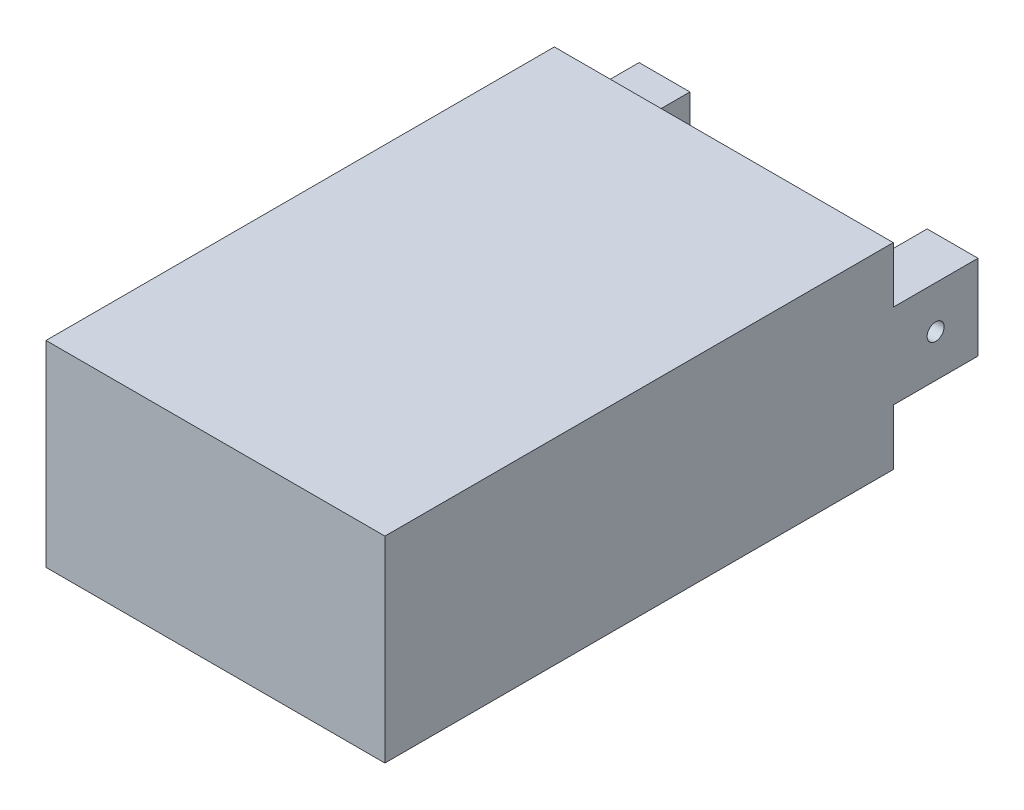
ISO-10303-21;
HEADER;
FILE_DESCRIPTION(('STEP AP214'),'2;1');
FILE_NAME('part.step','',(''),(''),'','','');
FILE_SCHEMA(('AUTOMOTIVE_DESIGN { 1 0 10303 214 1 1 1 1 }'));
ENDSEC;
DATA;
#1=APPLICATION_CONTEXT('core data for automotive mechanical design processes');
#2=APPLICATION_PROTOCOL_DEFINITION('international standard','automotive_design',2000,#1);
#3=PRODUCT_CONTEXT('',#1,'mechanical');
#4=PRODUCT('Part','Part','',(#3));
#5=PRODUCT_RELATED_PRODUCT_CATEGORY('part','',(#4));
#6=PRODUCT_DEFINITION_FORMATION('','',#4);
#7=PRODUCT_DEFINITION_CONTEXT('part definition',#1,'design');
#8=PRODUCT_DEFINITION('design','',#6,#7);
#9=PRODUCT_DEFINITION_SHAPE('','',#8);
#10=(LENGTH_UNIT() NAMED_UNIT(*) SI_UNIT(.MILLI.,.METRE.));
#11=(NAMED_UNIT(*) PLANE_ANGLE_UNIT() SI_UNIT($,.RADIAN.));
#12=(NAMED_UNIT(*) SI_UNIT($,.STERADIAN.) SOLID_ANGLE_UNIT());
#13=UNCERTAINTY_MEASURE_WITH_UNIT(LENGTH_MEASURE(1.E-05),#10,'distance_accuracy_value','');
#14=(GEOMETRIC_REPRESENTATION_CONTEXT(3) GLOBAL_UNCERTAINTY_ASSIGNED_CONTEXT((#13)) GLOBAL_UNIT_ASSIGNED_CONTEXT((#10,
#11,#12)) REPRESENTATION_CONTEXT('',''));
#15=CARTESIAN_POINT('',(0.,0.,0.));
#16=DIRECTION('',(0.,0.,1.));
#17=DIRECTION('',(1.,0.,0.));
#18=AXIS2_PLACEMENT_3D('',#15,#16,#17);
#19=CARTESIAN_POINT('',(0.,0.,0.));
#20=DIRECTION('',(0.,0.,1.));
#21=DIRECTION('',(1.,0.,0.));
#22=AXIS2_PLACEMENT_3D('',#19,#20,#21);
#23=PLANE('',#22);
#24=DIRECTION('',(-1.,0.,0.));
#25=VECTOR('',#24,1.);
#26=CARTESIAN_POINT('',(50.,-12.5,0.));
#27=LINE('',#26,#25);
#28=CARTESIAN_POINT('',(50.,-12.5,0.));
#29=VERTEX_POINT('',#28);
#30=CARTESIAN_POINT('',(35.,-12.5,0.));
#31=VERTEX_POINT('',#30);
#32=EDGE_CURVE('E235',#29,#31,#27,.T.);
#33=ORIENTED_EDGE('',*,*,#32,.F.);
#34=DIRECTION('',(0.,1.,0.));
#35=VECTOR('',#34,1.);
#36=CARTESIAN_POINT('',(50.,-29.,0.));
#37=LINE('',#36,#35);
#38=CARTESIAN_POINT('',(50.,-29.,0.));
#39=VERTEX_POINT('',#38);
#40=EDGE_CURVE('E159',#39,#29,#37,.T.);
#41=ORIENTED_EDGE('',*,*,#40,.F.);
#42=DIRECTION('',(1.,0.,0.));
#43=VECTOR('',#42,1.);
#44=CARTESIAN_POINT('',(50.,-29.,0.));
#45=LINE('',#44,#43);
#46=CARTESIAN_POINT('',(-50.,-29.,0.));
#47=VERTEX_POINT('',#46);
#48=EDGE_CURVE('E209',#47,#39,#45,.T.);
#49=ORIENTED_EDGE('',*,*,#48,.F.);
#50=DIRECTION('',(0.,-1.,0.));
#51=VECTOR('',#50,1.);
#52=CARTESIAN_POINT('',(-50.,-29.,0.));
#53=LINE('',#52,#51);
#54=CARTESIAN_POINT('',(-50.,-12.5,0.));
#55=VERTEX_POINT('',#54);
#56=EDGE_CURVE('E192',#55,#47,#53,.T.);
#57=ORIENTED_EDGE('',*,*,#56,.F.);
#58=DIRECTION('',(-1.,0.,0.));
#59=VECTOR('',#58,1.);
#60=CARTESIAN_POINT('',(-50.,-12.5,0.));
#61=LINE('',#60,#59);
#62=CARTESIAN_POINT('',(-35.,-12.5,0.));
#63=VERTEX_POINT('',#62);
#64=EDGE_CURVE('E70',#63,#55,#61,.T.);
#65=ORIENTED_EDGE('',*,*,#64,.F.);
#66=DIRECTION('',(0.,-1.,0.));
#67=VECTOR('',#66,1.);
#68=CARTESIAN_POINT('',(-35.,-12.5,0.));
#69=LINE('',#68,#67);
#70=CARTESIAN_POINT('',(-35.,12.5,0.));
#71=VERTEX_POINT('',#70);
#72=EDGE_CURVE('E163',#71,#63,#69,.T.);
#73=ORIENTED_EDGE('',*,*,#72,.F.);
#74=DIRECTION('',(1.,0.,0.));
#75=VECTOR('',#74,1.);
#76=CARTESIAN_POINT('',(-35.,12.5,0.));
#77=LINE('',#76,#75);
#78=CARTESIAN_POINT('',(-50.,12.5,0.));
#79=VERTEX_POINT('',#78);
#80=EDGE_CURVE('E160',#79,#71,#77,.T.);
#81=ORIENTED_EDGE('',*,*,#80,.F.);
#82=CARTESIAN_POINT('',(-50.,29.,0.));
#83=VERTEX_POINT('',#82);
#84=EDGE_CURVE('E204',#83,#79,#53,.T.);
#85=ORIENTED_EDGE('',*,*,#84,.F.);
#86=DIRECTION('',(-1.,0.,0.));
#87=VECTOR('',#86,1.);
#88=CARTESIAN_POINT('',(50.,29.,0.));
#89=LINE('',#88,#87);
#90=CARTESIAN_POINT('',(50.,29.,0.));
#91=VERTEX_POINT('',#90);
#92=EDGE_CURVE('E197',#91,#83,#89,.T.);
#93=ORIENTED_EDGE('',*,*,#92,.F.);
#94=CARTESIAN_POINT('',(50.,12.5,0.));
#95=VERTEX_POINT('',#94);
#96=EDGE_CURVE('E236',#95,#91,#37,.T.);
#97=ORIENTED_EDGE('',*,*,#96,.F.);
#98=DIRECTION('',(1.,0.,0.));
#99=VECTOR('',#98,1.);
#100=CARTESIAN_POINT('',(35.,12.5,0.));
#101=LINE('',#100,#99);
#102=CARTESIAN_POINT('',(35.,12.5,0.));
#103=VERTEX_POINT('',#102);
#104=EDGE_CURVE('E153',#103,#95,#101,.T.);
#105=ORIENTED_EDGE('',*,*,#104,.F.);
#106=DIRECTION('',(0.,1.,0.));
#107=VECTOR('',#106,1.);
#108=CARTESIAN_POINT('',(35.,-12.5,0.));
#109=LINE('',#108,#107);
#110=EDGE_CURVE('E410',#31,#103,#109,.T.);
#111=ORIENTED_EDGE('',*,*,#110,.F.);
#112=EDGE_LOOP('',(#33,#41,#49,#57,#65,#73,#81,#85,#93,#97,#105,#111));
#113=FACE_BOUND('',#112,.T.);
#114=ADVANCED_FACE('F46',(#113),#23,.F.);
#115=CARTESIAN_POINT('',(-50.,-29.,150.));
#116=DIRECTION('',(1.,0.,0.));
#117=DIRECTION('',(0.,0.,-1.));
#118=AXIS2_PLACEMENT_3D('',#115,#116,#117);
#119=PLANE('',#118);
#120=CARTESIAN_POINT('',(-50.,0.,-12.5));
#121=DIRECTION('',(-1.,0.,0.));
#122=DIRECTION('',(0.,0.,1.));
#123=AXIS2_PLACEMENT_3D('',#120,#121,#122);
#124=CIRCLE('',#123,2.5);
#125=CARTESIAN_POINT('',(-50.,0.,-10.));
#126=VERTEX_POINT('',#125);
#127=EDGE_CURVE('E425',#126,#126,#124,.T.);
#128=ORIENTED_EDGE('',*,*,#127,.F.);
#129=EDGE_LOOP('',(#128));
#130=FACE_BOUND('',#129,.T.);
#131=ORIENTED_EDGE('',*,*,#84,.T.);
#132=DIRECTION('',(0.,0.,1.));
#133=VECTOR('',#132,1.);
#134=CARTESIAN_POINT('',(-50.,12.5,-25.));
#135=LINE('',#134,#133);
#136=CARTESIAN_POINT('',(-50.,12.5,-25.));
#137=VERTEX_POINT('',#136);
#138=EDGE_CURVE('E189',#137,#79,#135,.T.);
#139=ORIENTED_EDGE('',*,*,#138,.F.);
#140=DIRECTION('',(0.,1.,0.));
#141=VECTOR('',#140,1.);
#142=CARTESIAN_POINT('',(-50.,12.5,-25.));
#143=LINE('',#142,#141);
#144=CARTESIAN_POINT('',(-50.,-12.5,-25.));
#145=VERTEX_POINT('',#144);
#146=EDGE_CURVE('E169',#145,#137,#143,.T.);
#147=ORIENTED_EDGE('',*,*,#146,.F.);
#148=DIRECTION('',(0.,0.,1.));
#149=VECTOR('',#148,1.);
#150=CARTESIAN_POINT('',(-50.,-12.5,-25.));
#151=LINE('',#150,#149);
#152=EDGE_CURVE('E177',#145,#55,#151,.T.);
#153=ORIENTED_EDGE('',*,*,#152,.T.);
#154=ORIENTED_EDGE('',*,*,#56,.T.);
#155=DIRECTION('',(0.,0.,-1.));
#156=VECTOR('',#155,1.);
#157=CARTESIAN_POINT('',(-50.,-29.,150.));
#158=LINE('',#157,#156);
#159=CARTESIAN_POINT('',(-50.,-29.,150.));
#160=VERTEX_POINT('',#159);
#161=EDGE_CURVE('E12',#160,#47,#158,.T.);
#162=ORIENTED_EDGE('',*,*,#161,.F.);
#163=DIRECTION('',(0.,-1.,0.));
#164=VECTOR('',#163,1.);
#165=CARTESIAN_POINT('',(-50.,-29.,150.));
#166=LINE('',#165,#164);
#167=CARTESIAN_POINT('',(-50.,29.,150.));
#168=VERTEX_POINT('',#167);
#169=EDGE_CURVE('E193',#168,#160,#166,.T.);
#170=ORIENTED_EDGE('',*,*,#169,.F.);
#171=DIRECTION('',(0.,0.,-1.));
#172=VECTOR('',#171,1.);
#173=CARTESIAN_POINT('',(-50.,29.,150.));
#174=LINE('',#173,#172);
#175=EDGE_CURVE('E203',#168,#83,#174,.T.);
#176=ORIENTED_EDGE('',*,*,#175,.T.);
#177=EDGE_LOOP('',(#131,#139,#147,#153,#154,#162,#170,#176));
#178=FACE_BOUND('',#177,.T.);
#179=ADVANCED_FACE('F48',(#130,#178),#119,.F.);
#180=CARTESIAN_POINT('',(50.,-29.,150.));
#181=DIRECTION('',(0.,1.,0.));
#182=DIRECTION('',(-1.,0.,0.));
#183=AXIS2_PLACEMENT_3D('',#180,#181,#182);
#184=PLANE('',#183);
#185=ORIENTED_EDGE('',*,*,#48,.T.);
#186=DIRECTION('',(0.,0.,-1.));
#187=VECTOR('',#186,1.);
#188=CARTESIAN_POINT('',(50.,-29.,150.));
#189=LINE('',#188,#187);
#190=CARTESIAN_POINT('',(50.,-29.,150.));
#191=VERTEX_POINT('',#190);
#192=EDGE_CURVE('E55',#191,#39,#189,.T.);
#193=ORIENTED_EDGE('',*,*,#192,.F.);
#194=DIRECTION('',(1.,0.,0.));
#195=VECTOR('',#194,1.);
#196=CARTESIAN_POINT('',(50.,-29.,150.));
#197=LINE('',#196,#195);
#198=EDGE_CURVE('E196',#160,#191,#197,.T.);
#199=ORIENTED_EDGE('',*,*,#198,.F.);
#200=ORIENTED_EDGE('',*,*,#161,.T.);
#201=EDGE_LOOP('',(#185,#193,#199,#200));
#202=FACE_BOUND('',#201,.T.);
#203=ADVANCED_FACE('F240',(#202),#184,.F.);
#204=CARTESIAN_POINT('',(50.,-29.,150.));
#205=DIRECTION('',(-1.,0.,0.));
#206=DIRECTION('',(0.,0.,1.));
#207=AXIS2_PLACEMENT_3D('',#204,#205,#206);
#208=PLANE('',#207);
#209=CARTESIAN_POINT('',(50.,0.,-12.5));
#210=DIRECTION('',(-1.,0.,0.));
#211=DIRECTION('',(0.,0.,1.));
#212=AXIS2_PLACEMENT_3D('',#209,#210,#211);
#213=CIRCLE('',#212,2.5);
#214=CARTESIAN_POINT('',(50.,0.,-10.));
#215=VERTEX_POINT('',#214);
#216=EDGE_CURVE('E413',#215,#215,#213,.F.);
#217=ORIENTED_EDGE('',*,*,#216,.F.);
#218=EDGE_LOOP('',(#217));
#219=FACE_BOUND('',#218,.T.);
#220=ORIENTED_EDGE('',*,*,#40,.T.);
#221=DIRECTION('',(0.,0.,1.));
#222=VECTOR('',#221,1.);
#223=CARTESIAN_POINT('',(50.,-12.5,-25.));
#224=LINE('',#223,#222);
#225=CARTESIAN_POINT('',(50.,-12.5,-25.));
#226=VERTEX_POINT('',#225);
#227=EDGE_CURVE('E141',#226,#29,#224,.T.);
#228=ORIENTED_EDGE('',*,*,#227,.F.);
#229=DIRECTION('',(0.,-1.,0.));
#230=VECTOR('',#229,1.);
#231=CARTESIAN_POINT('',(50.,12.5,-25.));
#232=LINE('',#231,#230);
#233=CARTESIAN_POINT('',(50.,12.5,-25.));
#234=VERTEX_POINT('',#233);
#235=EDGE_CURVE('E148',#234,#226,#232,.T.);
#236=ORIENTED_EDGE('',*,*,#235,.F.);
#237=DIRECTION('',(0.,0.,1.));
#238=VECTOR('',#237,1.);
#239=CARTESIAN_POINT('',(50.,12.5,-25.));
#240=LINE('',#239,#238);
#241=EDGE_CURVE('E62',#234,#95,#240,.T.);
#242=ORIENTED_EDGE('',*,*,#241,.T.);
#243=ORIENTED_EDGE('',*,*,#96,.T.);
#244=DIRECTION('',(0.,0.,-1.));
#245=VECTOR('',#244,1.);
#246=CARTESIAN_POINT('',(50.,29.,150.));
#247=LINE('',#246,#245);
#248=CARTESIAN_POINT('',(50.,29.,150.));
#249=VERTEX_POINT('',#248);
#250=EDGE_CURVE('E223',#249,#91,#247,.T.);
#251=ORIENTED_EDGE('',*,*,#250,.F.);
#252=DIRECTION('',(0.,1.,0.));
#253=VECTOR('',#252,1.);
#254=CARTESIAN_POINT('',(50.,-29.,150.));
#255=LINE('',#254,#253);
#256=EDGE_CURVE('E199',#191,#249,#255,.T.);
#257=ORIENTED_EDGE('',*,*,#256,.F.);
#258=ORIENTED_EDGE('',*,*,#192,.T.);
#259=EDGE_LOOP('',(#220,#228,#236,#242,#243,#251,#257,#258));
#260=FACE_BOUND('',#259,.T.);
#261=ADVANCED_FACE('F156',(#219,#260),#208,.F.);
#262=CARTESIAN_POINT('',(50.,29.,150.));
#263=DIRECTION('',(0.,-1.,0.));
#264=DIRECTION('',(1.,0.,0.));
#265=AXIS2_PLACEMENT_3D('',#262,#263,#264);
#266=PLANE('',#265);
#267=ORIENTED_EDGE('',*,*,#92,.T.);
#268=ORIENTED_EDGE('',*,*,#175,.F.);
#269=DIRECTION('',(-1.,0.,0.));
#270=VECTOR('',#269,1.);
#271=CARTESIAN_POINT('',(50.,29.,150.));
#272=LINE('',#271,#270);
#273=EDGE_CURVE('E201',#249,#168,#272,.T.);
#274=ORIENTED_EDGE('',*,*,#273,.F.);
#275=ORIENTED_EDGE('',*,*,#250,.T.);
#276=EDGE_LOOP('',(#267,#268,#274,#275));
#277=FACE_BOUND('',#276,.T.);
#278=ADVANCED_FACE('F262',(#277),#266,.F.);
#279=CARTESIAN_POINT('',(0.,0.,150.));
#280=DIRECTION('',(0.,0.,1.));
#281=DIRECTION('',(1.,0.,0.));
#282=AXIS2_PLACEMENT_3D('',#279,#280,#281);
#283=PLANE('',#282);
#284=ORIENTED_EDGE('',*,*,#169,.T.);
#285=ORIENTED_EDGE('',*,*,#198,.T.);
#286=ORIENTED_EDGE('',*,*,#256,.T.);
#287=ORIENTED_EDGE('',*,*,#273,.T.);
#288=EDGE_LOOP('',(#284,#285,#286,#287));
#289=FACE_BOUND('',#288,.T.);
#290=ADVANCED_FACE('F265',(#289),#283,.T.);
#291=CARTESIAN_POINT('',(-35.,12.5,-25.));
#292=DIRECTION('',(0.,-1.,0.));
#293=DIRECTION('',(1.,0.,0.));
#294=AXIS2_PLACEMENT_3D('',#291,#292,#293);
#295=PLANE('',#294);
#296=ORIENTED_EDGE('',*,*,#80,.T.);
#297=DIRECTION('',(0.,0.,1.));
#298=VECTOR('',#297,1.);
#299=CARTESIAN_POINT('',(-35.,12.5,-25.));
#300=LINE('',#299,#298);
#301=CARTESIAN_POINT('',(-35.,12.5,-25.));
#302=VERTEX_POINT('',#301);
#303=EDGE_CURVE('E186',#302,#71,#300,.T.);
#304=ORIENTED_EDGE('',*,*,#303,.F.);
#305=DIRECTION('',(1.,0.,0.));
#306=VECTOR('',#305,1.);
#307=CARTESIAN_POINT('',(-35.,12.5,-25.));
#308=LINE('',#307,#306);
#309=EDGE_CURVE('E172',#137,#302,#308,.T.);
#310=ORIENTED_EDGE('',*,*,#309,.F.);
#311=ORIENTED_EDGE('',*,*,#138,.T.);
#312=EDGE_LOOP('',(#296,#304,#310,#311));
#313=FACE_BOUND('',#312,.T.);
#314=ADVANCED_FACE('F256',(#313),#295,.F.);
#315=CARTESIAN_POINT('',(-35.,-12.5,-25.));
#316=DIRECTION('',(-1.,0.,0.));
#317=DIRECTION('',(0.,0.,1.));
#318=AXIS2_PLACEMENT_3D('',#315,#316,#317);
#319=PLANE('',#318);
#320=CARTESIAN_POINT('',(-35.,0.,-12.5));
#321=DIRECTION('',(-1.,0.,0.));
#322=DIRECTION('',(0.,0.,1.));
#323=AXIS2_PLACEMENT_3D('',#320,#321,#322);
#324=CIRCLE('',#323,2.5);
#325=CARTESIAN_POINT('',(-35.,0.,-10.));
#326=VERTEX_POINT('',#325);
#327=EDGE_CURVE('E408',#326,#326,#324,.T.);
#328=ORIENTED_EDGE('',*,*,#327,.T.);
#329=EDGE_LOOP('',(#328));
#330=FACE_BOUND('',#329,.T.);
#331=ORIENTED_EDGE('',*,*,#72,.T.);
#332=DIRECTION('',(0.,0.,1.));
#333=VECTOR('',#332,1.);
#334=CARTESIAN_POINT('',(-35.,-12.5,-25.));
#335=LINE('',#334,#333);
#336=CARTESIAN_POINT('',(-35.,-12.5,-25.));
#337=VERTEX_POINT('',#336);
#338=EDGE_CURVE('E183',#337,#63,#335,.T.);
#339=ORIENTED_EDGE('',*,*,#338,.F.);
#340=DIRECTION('',(0.,-1.,0.));
#341=VECTOR('',#340,1.);
#342=CARTESIAN_POINT('',(-35.,-12.5,-25.));
#343=LINE('',#342,#341);
#344=EDGE_CURVE('E174',#302,#337,#343,.T.);
#345=ORIENTED_EDGE('',*,*,#344,.F.);
#346=ORIENTED_EDGE('',*,*,#303,.T.);
#347=EDGE_LOOP('',(#331,#339,#345,#346));
#348=FACE_BOUND('',#347,.T.);
#349=ADVANCED_FACE('F252',(#330,#348),#319,.F.);
#350=CARTESIAN_POINT('',(-50.,-12.5,-25.));
#351=DIRECTION('',(0.,1.,0.));
#352=DIRECTION('',(-1.,0.,0.));
#353=AXIS2_PLACEMENT_3D('',#350,#351,#352);
#354=PLANE('',#353);
#355=ORIENTED_EDGE('',*,*,#64,.T.);
#356=ORIENTED_EDGE('',*,*,#152,.F.);
#357=DIRECTION('',(-1.,0.,0.));
#358=VECTOR('',#357,1.);
#359=CARTESIAN_POINT('',(-50.,-12.5,-25.));
#360=LINE('',#359,#358);
#361=EDGE_CURVE('E176',#337,#145,#360,.T.);
#362=ORIENTED_EDGE('',*,*,#361,.F.);
#363=ORIENTED_EDGE('',*,*,#338,.T.);
#364=EDGE_LOOP('',(#355,#356,#362,#363));
#365=FACE_BOUND('',#364,.T.);
#366=ADVANCED_FACE('F247',(#365),#354,.F.);
#367=CARTESIAN_POINT('',(0.,0.,-25.));
#368=DIRECTION('',(0.,0.,1.));
#369=DIRECTION('',(1.,0.,0.));
#370=AXIS2_PLACEMENT_3D('',#367,#368,#369);
#371=PLANE('',#370);
#372=ORIENTED_EDGE('',*,*,#146,.T.);
#373=ORIENTED_EDGE('',*,*,#309,.T.);
#374=ORIENTED_EDGE('',*,*,#344,.T.);
#375=ORIENTED_EDGE('',*,*,#361,.T.);
#376=EDGE_LOOP('',(#372,#373,#374,#375));
#377=FACE_BOUND('',#376,.T.);
#378=ADVANCED_FACE('F325',(#377),#371,.F.);
#379=CARTESIAN_POINT('',(50.,-12.5,-25.));
#380=DIRECTION('',(0.,1.,0.));
#381=DIRECTION('',(-1.,0.,0.));
#382=AXIS2_PLACEMENT_3D('',#379,#380,#381);
#383=PLANE('',#382);
#384=ORIENTED_EDGE('',*,*,#32,.T.);
#385=DIRECTION('',(0.,0.,1.));
#386=VECTOR('',#385,1.);
#387=CARTESIAN_POINT('',(35.,-12.5,-25.));
#388=LINE('',#387,#386);
#389=CARTESIAN_POINT('',(35.,-12.5,-25.));
#390=VERTEX_POINT('',#389);
#391=EDGE_CURVE('E144',#390,#31,#388,.T.);
#392=ORIENTED_EDGE('',*,*,#391,.F.);
#393=DIRECTION('',(-1.,0.,0.));
#394=VECTOR('',#393,1.);
#395=CARTESIAN_POINT('',(50.,-12.5,-25.));
#396=LINE('',#395,#394);
#397=EDGE_CURVE('E137',#226,#390,#396,.T.);
#398=ORIENTED_EDGE('',*,*,#397,.F.);
#399=ORIENTED_EDGE('',*,*,#227,.T.);
#400=EDGE_LOOP('',(#384,#392,#398,#399));
#401=FACE_BOUND('',#400,.T.);
#402=ADVANCED_FACE('F139',(#401),#383,.F.);
#403=CARTESIAN_POINT('',(35.,-12.5,-25.));
#404=DIRECTION('',(1.,0.,0.));
#405=DIRECTION('',(0.,0.,-1.));
#406=AXIS2_PLACEMENT_3D('',#403,#404,#405);
#407=PLANE('',#406);
#408=CARTESIAN_POINT('',(35.,0.,-12.5));
#409=DIRECTION('',(1.,0.,0.));
#410=DIRECTION('',(0.,0.,-1.));
#411=AXIS2_PLACEMENT_3D('',#408,#409,#410);
#412=CIRCLE('',#411,2.5);
#413=CARTESIAN_POINT('',(35.,0.,-15.));
#414=VERTEX_POINT('',#413);
#415=EDGE_CURVE('E50',#414,#414,#412,.T.);
#416=ORIENTED_EDGE('',*,*,#415,.T.);
#417=EDGE_LOOP('',(#416));
#418=FACE_BOUND('',#417,.T.);
#419=ORIENTED_EDGE('',*,*,#110,.T.);
#420=DIRECTION('',(0.,0.,1.));
#421=VECTOR('',#420,1.);
#422=CARTESIAN_POINT('',(35.,12.5,-25.));
#423=LINE('',#422,#421);
#424=CARTESIAN_POINT('',(35.,12.5,-25.));
#425=VERTEX_POINT('',#424);
#426=EDGE_CURVE('E165',#425,#103,#423,.T.);
#427=ORIENTED_EDGE('',*,*,#426,.F.);
#428=DIRECTION('',(0.,1.,0.));
#429=VECTOR('',#428,1.);
#430=CARTESIAN_POINT('',(35.,-12.5,-25.));
#431=LINE('',#430,#429);
#432=EDGE_CURVE('E147',#390,#425,#431,.T.);
#433=ORIENTED_EDGE('',*,*,#432,.F.);
#434=ORIENTED_EDGE('',*,*,#391,.T.);
#435=EDGE_LOOP('',(#419,#427,#433,#434));
#436=FACE_BOUND('',#435,.T.);
#437=ADVANCED_FACE('F343',(#418,#436),#407,.F.);
#438=CARTESIAN_POINT('',(35.,12.5,-25.));
#439=DIRECTION('',(0.,-1.,0.));
#440=DIRECTION('',(1.,0.,0.));
#441=AXIS2_PLACEMENT_3D('',#438,#439,#440);
#442=PLANE('',#441);
#443=ORIENTED_EDGE('',*,*,#104,.T.);
#444=ORIENTED_EDGE('',*,*,#241,.F.);
#445=DIRECTION('',(1.,0.,0.));
#446=VECTOR('',#445,1.);
#447=CARTESIAN_POINT('',(35.,12.5,-25.));
#448=LINE('',#447,#446);
#449=EDGE_CURVE('E152',#425,#234,#448,.T.);
#450=ORIENTED_EDGE('',*,*,#449,.F.);
#451=ORIENTED_EDGE('',*,*,#426,.T.);
#452=EDGE_LOOP('',(#443,#444,#450,#451));
#453=FACE_BOUND('',#452,.T.);
#454=ADVANCED_FACE('F350',(#453),#442,.F.);
#455=CARTESIAN_POINT('',(0.,0.,-25.));
#456=DIRECTION('',(0.,0.,-1.));
#457=DIRECTION('',(-1.,0.,0.));
#458=AXIS2_PLACEMENT_3D('',#455,#456,#457);
#459=PLANE('',#458);
#460=ORIENTED_EDGE('',*,*,#235,.T.);
#461=ORIENTED_EDGE('',*,*,#397,.T.);
#462=ORIENTED_EDGE('',*,*,#432,.T.);
#463=ORIENTED_EDGE('',*,*,#449,.T.);
#464=EDGE_LOOP('',(#460,#461,#462,#463));
#465=FACE_BOUND('',#464,.T.);
#466=ADVANCED_FACE('F150',(#465),#459,.T.);
#467=CARTESIAN_POINT('',(57.0710678118655,0.,-12.5));
#468=DIRECTION('',(-1.,0.,0.));
#469=DIRECTION('',(0.,0.,1.));
#470=AXIS2_PLACEMENT_3D('',#467,#468,#469);
#471=CYLINDRICAL_SURFACE('',#470,2.5);
#472=ORIENTED_EDGE('',*,*,#216,.T.);
#473=EDGE_LOOP('',(#472));
#474=FACE_BOUND('',#473,.T.);
#475=ORIENTED_EDGE('',*,*,#415,.F.);
#476=EDGE_LOOP('',(#475));
#477=FACE_BOUND('',#476,.T.);
#478=ADVANCED_FACE('F363',(#474,#477),#471,.F.);
#479=ORIENTED_EDGE('',*,*,#127,.T.);
#480=EDGE_LOOP('',(#479));
#481=FACE_BOUND('',#480,.T.);
#482=ORIENTED_EDGE('',*,*,#327,.F.);
#483=EDGE_LOOP('',(#482));
#484=FACE_BOUND('',#483,.T.);
#485=ADVANCED_FACE('F385',(#481,#484),#471,.F.);
#486=CLOSED_SHELL('',(#114,#179,#203,#261,#278,#290,#314,#349,#366,#378,#402,#437,#454,#466,
#478,#485));
#487=MANIFOLD_SOLID_BREP('B2',#486);
#488=ADVANCED_BREP_SHAPE_REPRESENTATION('',(#18,#487),#14);
#489=SHAPE_DEFINITION_REPRESENTATION(#9,#488);
ENDSEC;
END-ISO-10303-21;
